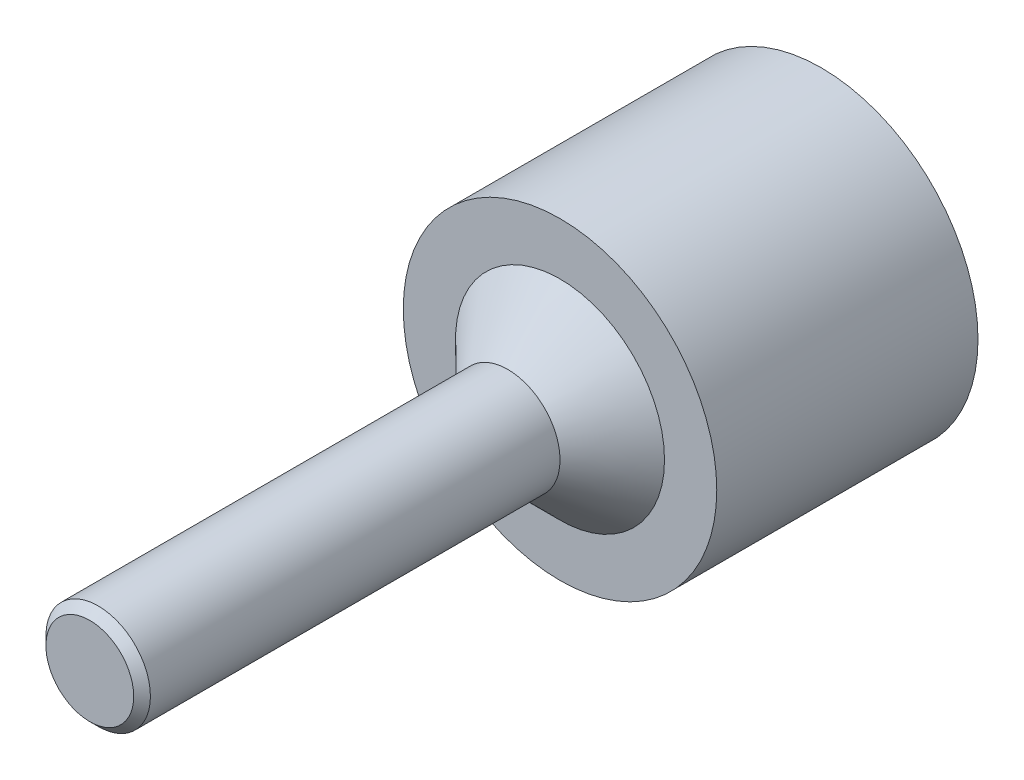
ISO-10303-21;
HEADER;
FILE_DESCRIPTION(('STEP AP214'),'2;1');
FILE_NAME('part.step','',(''),(''),'','','');
FILE_SCHEMA(('AUTOMOTIVE_DESIGN { 1 0 10303 214 1 1 1 1 }'));
ENDSEC;
DATA;
#1=APPLICATION_CONTEXT('core data for automotive mechanical design processes');
#2=APPLICATION_PROTOCOL_DEFINITION('international standard','automotive_design',2000,#1);
#3=PRODUCT_CONTEXT('',#1,'mechanical');
#4=PRODUCT('Part','Part','',(#3));
#5=PRODUCT_RELATED_PRODUCT_CATEGORY('part','',(#4));
#6=PRODUCT_DEFINITION_FORMATION('','',#4);
#7=PRODUCT_DEFINITION_CONTEXT('part definition',#1,'design');
#8=PRODUCT_DEFINITION('design','',#6,#7);
#9=PRODUCT_DEFINITION_SHAPE('','',#8);
#10=(LENGTH_UNIT() NAMED_UNIT(*) SI_UNIT(.MILLI.,.METRE.));
#11=(NAMED_UNIT(*) PLANE_ANGLE_UNIT() SI_UNIT($,.RADIAN.));
#12=(NAMED_UNIT(*) SI_UNIT($,.STERADIAN.) SOLID_ANGLE_UNIT());
#13=UNCERTAINTY_MEASURE_WITH_UNIT(LENGTH_MEASURE(1.E-05),#10,'distance_accuracy_value','');
#14=(GEOMETRIC_REPRESENTATION_CONTEXT(3) GLOBAL_UNCERTAINTY_ASSIGNED_CONTEXT((#13)) GLOBAL_UNIT_ASSIGNED_CONTEXT((#10,
#11,#12)) REPRESENTATION_CONTEXT('',''));
#15=CARTESIAN_POINT('',(0.,0.,0.));
#16=DIRECTION('',(0.,0.,1.));
#17=DIRECTION('',(1.,0.,0.));
#18=AXIS2_PLACEMENT_3D('',#15,#16,#17);
#19=CARTESIAN_POINT('',(0.,0.,0.));
#20=DIRECTION('',(0.,0.,1.));
#21=DIRECTION('',(1.,0.,0.));
#22=AXIS2_PLACEMENT_3D('',#19,#20,#21);
#23=PLANE('',#22);
#24=CARTESIAN_POINT('',(0.,0.,0.));
#25=DIRECTION('',(0.,0.,1.));
#26=DIRECTION('',(1.,0.,0.));
#27=AXIS2_PLACEMENT_3D('',#24,#25,#26);
#28=CIRCLE('',#27,2.66700000000002);
#29=CARTESIAN_POINT('',(2.66700000000002,0.,0.));
#30=VERTEX_POINT('',#29);
#31=EDGE_CURVE('E54',#30,#30,#28,.T.);
#32=ORIENTED_EDGE('',*,*,#31,.T.);
#33=EDGE_LOOP('',(#32));
#34=FACE_BOUND('',#33,.T.);
#35=ADVANCED_FACE('F34',(#34),#23,.T.);
#36=CARTESIAN_POINT('',(0.,0.,-44.45));
#37=DIRECTION('',(0.,0.,-1.));
#38=DIRECTION('',(-1.,0.,0.));
#39=AXIS2_PLACEMENT_3D('',#36,#37,#38);
#40=CYLINDRICAL_SURFACE('',#39,3.175);
#41=CARTESIAN_POINT('',(0.,0.,-25.4));
#42=DIRECTION('',(0.,0.,1.));
#43=DIRECTION('',(1.,0.,0.));
#44=AXIS2_PLACEMENT_3D('',#41,#42,#43);
#45=CIRCLE('',#44,3.175);
#46=CARTESIAN_POINT('',(3.175,0.,-25.4));
#47=VERTEX_POINT('',#46);
#48=EDGE_CURVE('E45',#47,#47,#45,.T.);
#49=ORIENTED_EDGE('',*,*,#48,.T.);
#50=EDGE_LOOP('',(#49));
#51=FACE_BOUND('',#50,.T.);
#52=CARTESIAN_POINT('',(0.,0.,-0.507999999999981));
#53=DIRECTION('',(0.,0.,1.));
#54=DIRECTION('',(1.,0.,0.));
#55=AXIS2_PLACEMENT_3D('',#52,#53,#54);
#56=CIRCLE('',#55,3.175);
#57=CARTESIAN_POINT('',(3.175,0.,-0.507999999999981));
#58=VERTEX_POINT('',#57);
#59=EDGE_CURVE('E57',#58,#58,#56,.F.);
#60=ORIENTED_EDGE('',*,*,#59,.T.);
#61=EDGE_LOOP('',(#60));
#62=FACE_BOUND('',#61,.T.);
#63=ADVANCED_FACE('F111',(#51,#62),#40,.T.);
#64=CARTESIAN_POINT('',(0.,3.175,-28.575));
#65=DIRECTION('',(0.,0.,1.));
#66=DIRECTION('',(1.,0.,0.));
#67=AXIS2_PLACEMENT_3D('',#64,#65,#66);
#68=PLANE('',#67);
#69=CARTESIAN_POINT('',(0.,0.,-28.575));
#70=DIRECTION('',(0.,0.,1.));
#71=DIRECTION('',(1.,0.,0.));
#72=AXIS2_PLACEMENT_3D('',#69,#70,#71);
#73=CIRCLE('',#72,6.35000000000003);
#74=CARTESIAN_POINT('',(6.35000000000003,0.,-28.575));
#75=VERTEX_POINT('',#74);
#76=EDGE_CURVE('E49',#75,#75,#73,.F.);
#77=ORIENTED_EDGE('',*,*,#76,.T.);
#78=EDGE_LOOP('',(#77));
#79=FACE_BOUND('',#78,.T.);
#80=CARTESIAN_POINT('',(0.,0.,-28.575));
#81=DIRECTION('',(0.,0.,-1.));
#82=DIRECTION('',(-1.,0.,0.));
#83=AXIS2_PLACEMENT_3D('',#80,#81,#82);
#84=CIRCLE('',#83,9.525);
#85=CARTESIAN_POINT('',(-9.525,0.,-28.575));
#86=VERTEX_POINT('',#85);
#87=EDGE_CURVE('E60',#86,#86,#84,.T.);
#88=ORIENTED_EDGE('',*,*,#87,.F.);
#89=EDGE_LOOP('',(#88));
#90=FACE_BOUND('',#89,.T.);
#91=ADVANCED_FACE('F107',(#79,#90),#68,.T.);
#92=CARTESIAN_POINT('',(0.,0.,-44.45));
#93=DIRECTION('',(0.,0.,-1.));
#94=DIRECTION('',(-1.,0.,0.));
#95=AXIS2_PLACEMENT_3D('',#92,#93,#94);
#96=CYLINDRICAL_SURFACE('',#95,9.525);
#97=CARTESIAN_POINT('',(0.,-9.525,-36.0553));
#98=CARTESIAN_POINT('',(0.0632509375219132,-9.52499915479188,-36.055297297543));
#99=CARTESIAN_POINT('',(0.126542029749758,-9.5243633064193,-36.0499728767562));
#100=CARTESIAN_POINT('',(0.251364820472078,-9.52188793721448,-36.0288157596332));
#101=CARTESIAN_POINT('',(0.312894581904218,-9.52004714057458,-36.0129719250133));
#102=CARTESIAN_POINT('',(0.432369436874991,-9.51536936505536,-35.9712478166958));
#103=CARTESIAN_POINT('',(0.490316847005159,-9.51253303804938,-35.9453741094042));
#104=CARTESIAN_POINT('',(0.601035404846345,-9.506180121912,-35.8843386531454));
#105=CARTESIAN_POINT('',(0.653807476710619,-9.5026636545669,-35.849178566591));
#106=CARTESIAN_POINT('',(0.75295182295395,-9.49532382723017,-35.7703809010455));
#107=CARTESIAN_POINT('',(0.799294604149035,-9.49149917244225,-35.7267063302383));
#108=CARTESIAN_POINT('',(0.884010990406445,-9.48398454417843,-35.6321987812117));
#109=CARTESIAN_POINT('',(0.9223842000221,-9.48029457739317,-35.5813654479875));
#110=CARTESIAN_POINT('',(0.990180703567409,-9.47345427413314,-35.4737934148364));
#111=CARTESIAN_POINT('',(1.01957659957805,-9.47030560217059,-35.4170373326192));
#112=CARTESIAN_POINT('',(1.06840907808638,-9.46492124661159,-35.299350669313));
#113=CARTESIAN_POINT('',(1.08784600183097,-9.46268553173296,-35.2384202313406));
#114=CARTESIAN_POINT('',(1.11611970355341,-9.45939245018979,-35.1144193257095));
#115=CARTESIAN_POINT('',(1.12500607633105,-9.45832957207026,-35.0513603151556));
#116=CARTESIAN_POINT('',(1.13207984575786,-9.45748558744171,-34.9246377020031));
#117=CARTESIAN_POINT('',(1.13026763163491,-9.45770443430195,-34.8609741214835));
#118=CARTESIAN_POINT('',(1.11603642445577,-9.45939413033264,-34.7351941413619));
#119=CARTESIAN_POINT('',(1.10367192939602,-9.4608585465419,-34.673071476993));
#120=CARTESIAN_POINT('',(1.06877210956582,-9.46486434331535,-34.5517891324808));
#121=CARTESIAN_POINT('',(1.04623659739191,-9.4674057437232,-34.4926295069546));
#122=CARTESIAN_POINT('',(0.991575435750871,-9.47328648500057,-34.3787824780618));
#123=CARTESIAN_POINT('',(0.959425968133552,-9.47662780348318,-34.3241066167749));
#124=CARTESIAN_POINT('',(0.886466559501058,-9.48373033604865,-34.2209055915384));
#125=CARTESIAN_POINT('',(0.845656261347887,-9.48749156744401,-34.1723806813613));
#126=CARTESIAN_POINT('',(0.756230970668205,-9.49503875161689,-34.0825425781642));
#127=CARTESIAN_POINT('',(0.707568978368591,-9.49882471254411,-34.041276155214));
#128=CARTESIAN_POINT('',(0.603983835638155,-9.5059728190733,-33.9674901344518));
#129=CARTESIAN_POINT('',(0.54906067309011,-9.50933496385503,-33.934970553568));
#130=CARTESIAN_POINT('',(0.434477192227891,-9.51525841591306,-33.8796018187119));
#131=CARTESIAN_POINT('',(0.374815519825478,-9.51781949323438,-33.8567554408717));
#132=CARTESIAN_POINT('',(0.252465658532564,-9.52185010274536,-33.8214179814958));
#133=CARTESIAN_POINT('',(0.189777597381649,-9.52331968096283,-33.8089264632998));
#134=CARTESIAN_POINT('',(0.0635590107666494,-9.52499574893122,-33.7947135769098));
#135=CARTESIAN_POINT('',(3.58400083115345E-05,-9.52520979797053,-33.7929277504638));
#136=CARTESIAN_POINT('',(-0.126404631849715,-9.5243710616825,-33.8000070558713));
#137=CARTESIAN_POINT('',(-0.189321944527946,-9.52331830061377,-33.8088719837697));
#138=CARTESIAN_POINT('',(-0.31257565042343,-9.52006897220776,-33.8369476249329));
#139=CARTESIAN_POINT('',(-0.372919106821374,-9.51787578670261,-33.8561277550712));
#140=CARTESIAN_POINT('',(-0.489532754276605,-9.51259128030109,-33.9042576519216));
#141=CARTESIAN_POINT('',(-0.545802819522162,-9.50949993167863,-33.9332077202341));
#142=CARTESIAN_POINT('',(-0.652961239170925,-9.50274519697551,-34.0002127279642));
#143=CARTESIAN_POINT('',(-0.703823242482479,-9.49907920769755,-34.0383095427701));
#144=CARTESIAN_POINT('',(-0.798454027403535,-9.49159384532421,-34.1224671551165));
#145=CARTESIAN_POINT('',(-0.84222255607325,-9.48777446676533,-34.1685282365267));
#146=CARTESIAN_POINT('',(-0.921651327981496,-9.48038962493188,-34.2675900911426));
#147=CARTESIAN_POINT('',(-0.957268957312505,-9.47682556018667,-34.3206251519108));
#148=CARTESIAN_POINT('',(-1.01909088187736,-9.47037744686408,-34.4319623704647));
#149=CARTESIAN_POINT('',(-1.04529534989561,-9.46749338580514,-34.4902644315466));
#150=CARTESIAN_POINT('',(-1.08747746493127,-9.46274116392142,-34.6103408097394));
#151=CARTESIAN_POINT('',(-1.10347950086257,-9.46087058199655,-34.6721064592944));
#152=CARTESIAN_POINT('',(-1.12488122562179,-9.45835002776142,-34.7974716266512));
#153=CARTESIAN_POINT('',(-1.13028135522926,-9.45770000470587,-34.8610710681007));
#154=CARTESIAN_POINT('',(-1.1303184331302,-9.45769553968786,-34.9878746425039));
#155=CARTESIAN_POINT('',(-1.12502232452988,-9.45833303967828,-35.0510787661036));
#156=CARTESIAN_POINT('',(-1.10395863981905,-9.46081450631757,-35.1756920137754));
#157=CARTESIAN_POINT('',(-1.08819105929352,-9.46265847347512,-35.2371011370908));
#158=CARTESIAN_POINT('',(-1.04665229311139,-9.4673426850713,-35.3563746331136));
#159=CARTESIAN_POINT('',(-1.02088399489125,-9.47018264192209,-35.4142400233998));
#160=CARTESIAN_POINT('',(-0.960081888687954,-9.47653934827966,-35.5248359739942));
#161=CARTESIAN_POINT('',(-0.925048010140118,-9.48005610294073,-35.5775664951921));
#162=CARTESIAN_POINT('',(-0.846459876445609,-9.4873965412942,-35.6767384262747));
#163=CARTESIAN_POINT('',(-0.802855698093828,-9.4912219419892,-35.7231401500643));
#164=CARTESIAN_POINT('',(-0.708467950989531,-9.49873331929353,-35.8079943441698));
#165=CARTESIAN_POINT('',(-0.657682685184871,-9.50241926268421,-35.8464449301491));
#166=CARTESIAN_POINT('',(-0.55017587524167,-9.50925025151029,-35.9144161624646));
#167=CARTESIAN_POINT('',(-0.493434507280825,-9.51239339223359,-35.9439056282208));
#168=CARTESIAN_POINT('',(-0.375800731512537,-9.51776504462355,-35.9928963446553));
#169=CARTESIAN_POINT('',(-0.314912964671017,-9.51999455988771,-36.0124085609953));
#170=CARTESIAN_POINT('',(-0.211418114793812,-9.5227440281588,-36.0361665421134));
#171=CARTESIAN_POINT('',(-0.169466299617016,-9.52358594491639,-36.0433314180665));
#172=CARTESIAN_POINT('',(-0.0850157018599239,-9.52471421312899,-36.0528990400399));
#173=CARTESIAN_POINT('',(-0.0425169227863945,-9.52500056814412,-36.0553018165763));
#174=CARTESIAN_POINT('',(0.,-9.525,-36.0553));
#175=B_SPLINE_CURVE_WITH_KNOTS('',3,(#97,#98,#99,#100,#101,#102,#103,#104,#105,#106,#107,#108,
#109,#110,#111,#112,#113,#114,#115,#116,#117,#118,#119,#120,#121,#122,#123,#124,#125,#126,#127,
#128,#129,#130,#131,#132,#133,#134,#135,#136,#137,#138,#139,#140,#141,#142,#143,#144,#145,#146,
#147,#148,#149,#150,#151,#152,#153,#154,#155,#156,#157,#158,#159,#160,#161,#162,#163,#164,#165,
#166,#167,#168,#169,#170,#171,#172,#173,#174),.UNSPECIFIED.,.T.,.F.,(4,2,2,2,2,2,2,2,2,2,2,2,2,
2,2,2,2,2,2,2,2,2,2,2,2,2,2,2,2,2,2,2,2,2,2,2,2,2,4),(0.,0.189597524312163,0.379396121234884,
0.569070669169936,0.758711285265451,0.949194948105546,1.13968806040505,1.33075686013229,
1.52181911239724,1.71197964005891,1.90213324948718,2.09131069927981,2.28049163485502,
2.47014519648381,2.65980658018673,2.8506485273792,3.04149084391374,3.232387893604,
3.4232768928326,3.61301539850876,3.80275027087081,3.99192568241037,4.18110693437604,
4.37117138460746,4.56124261068453,4.75228593782412,4.94332575806604,5.13390716820241,
5.32448065465381,5.51386512071869,5.70324966663246,5.89257957351562,6.08191092233626,
6.27237971236643,6.46289358990969,6.65406297150348,6.8450217911509,6.97246899232318,
7.09991537679581),.UNSPECIFIED.);
#176=CARTESIAN_POINT('',(0.,-9.525,-36.0553));
#177=VERTEX_POINT('',#176);
#178=EDGE_CURVE('E220',#177,#177,#175,.T.);
#179=ORIENTED_EDGE('',*,*,#178,.F.);
#180=EDGE_LOOP('',(#179));
#181=FACE_BOUND('',#180,.T.);
#182=CARTESIAN_POINT('',(0.,-9.525,-42.4053));
#183=CARTESIAN_POINT('',(0.0632509375219132,-9.52499915479188,-42.405297297543));
#184=CARTESIAN_POINT('',(0.126542029749758,-9.5243633064193,-42.3999728767562));
#185=CARTESIAN_POINT('',(0.251364820472078,-9.52188793721448,-42.3788157596331));
#186=CARTESIAN_POINT('',(0.312894581904218,-9.52004714057458,-42.3629719250133));
#187=CARTESIAN_POINT('',(0.432369436874991,-9.51536936505536,-42.3212478166958));
#188=CARTESIAN_POINT('',(0.490316847005159,-9.51253303804938,-42.2953741094042));
#189=CARTESIAN_POINT('',(0.601035404846345,-9.506180121912,-42.2343386531454));
#190=CARTESIAN_POINT('',(0.65380747671062,-9.5026636545669,-42.199178566591));
#191=CARTESIAN_POINT('',(0.752951822953947,-9.49532382723017,-42.1203809010455));
#192=CARTESIAN_POINT('',(0.79929460414903,-9.49149917244225,-42.0767063302383));
#193=CARTESIAN_POINT('',(0.884010990406441,-9.48398454417843,-41.9821987812117));
#194=CARTESIAN_POINT('',(0.922384200022098,-9.48029457739317,-41.9313654479875));
#195=CARTESIAN_POINT('',(0.990180703567409,-9.47345427413314,-41.8237934148364));
#196=CARTESIAN_POINT('',(1.01957659957805,-9.47030560217059,-41.7670373326192));
#197=CARTESIAN_POINT('',(1.06840907808638,-9.46492124661159,-41.649350669313));
#198=CARTESIAN_POINT('',(1.08784600183097,-9.46268553173296,-41.5884202313406));
#199=CARTESIAN_POINT('',(1.11611970355341,-9.45939245018979,-41.4644193257095));
#200=CARTESIAN_POINT('',(1.12500607633105,-9.45832957207026,-41.4013603151556));
#201=CARTESIAN_POINT('',(1.13207984575786,-9.45748558744171,-41.2746377020031));
#202=CARTESIAN_POINT('',(1.13026763163491,-9.45770443430195,-41.2109741214835));
#203=CARTESIAN_POINT('',(1.11603642445577,-9.45939413033264,-41.0851941413619));
#204=CARTESIAN_POINT('',(1.10367192939602,-9.4608585465419,-41.023071476993));
#205=CARTESIAN_POINT('',(1.06877210956582,-9.46486434331535,-40.9017891324808));
#206=CARTESIAN_POINT('',(1.04623659739191,-9.4674057437232,-40.8426295069546));
#207=CARTESIAN_POINT('',(0.99157543575087,-9.47328648500057,-40.7287824780617));
#208=CARTESIAN_POINT('',(0.95942596813355,-9.47662780348318,-40.6741066167748));
#209=CARTESIAN_POINT('',(0.886466559501056,-9.48373033604865,-40.5709055915384));
#210=CARTESIAN_POINT('',(0.845656261347885,-9.48749156744401,-40.5223806813613));
#211=CARTESIAN_POINT('',(0.756230970668205,-9.49503875161689,-40.4325425781642));
#212=CARTESIAN_POINT('',(0.707568978368591,-9.49882471254411,-40.391276155214));
#213=CARTESIAN_POINT('',(0.603983835638155,-9.5059728190733,-40.3174901344518));
#214=CARTESIAN_POINT('',(0.54906067309011,-9.50933496385503,-40.284970553568));
#215=CARTESIAN_POINT('',(0.434477192227891,-9.51525841591306,-40.2296018187119));
#216=CARTESIAN_POINT('',(0.374815519825478,-9.51781949323438,-40.2067554408717));
#217=CARTESIAN_POINT('',(0.252465658532564,-9.52185010274536,-40.1714179814958));
#218=CARTESIAN_POINT('',(0.189777597381649,-9.52331968096283,-40.1589264632998));
#219=CARTESIAN_POINT('',(0.0635590107666494,-9.52499574893122,-40.1447135769098));
#220=CARTESIAN_POINT('',(3.58400083115345E-05,-9.52520979797053,-40.1429277504638));
#221=CARTESIAN_POINT('',(-0.126404631849715,-9.5243710616825,-40.1500070558713));
#222=CARTESIAN_POINT('',(-0.189321944527946,-9.52331830061377,-40.1588719837697));
#223=CARTESIAN_POINT('',(-0.31257565042343,-9.52006897220776,-40.1869476249329));
#224=CARTESIAN_POINT('',(-0.372919106821374,-9.51787578670261,-40.2061277550712));
#225=CARTESIAN_POINT('',(-0.489532754276605,-9.51259128030109,-40.2542576519216));
#226=CARTESIAN_POINT('',(-0.545802819522162,-9.50949993167863,-40.2832077202341));
#227=CARTESIAN_POINT('',(-0.652961239170925,-9.50274519697551,-40.3502127279642));
#228=CARTESIAN_POINT('',(-0.703823242482479,-9.49907920769755,-40.3883095427701));
#229=CARTESIAN_POINT('',(-0.798454027403535,-9.49159384532421,-40.4724671551165));
#230=CARTESIAN_POINT('',(-0.84222255607325,-9.48777446676533,-40.5185282365267));
#231=CARTESIAN_POINT('',(-0.921651327981496,-9.48038962493188,-40.6175900911426));
#232=CARTESIAN_POINT('',(-0.957268957312505,-9.47682556018667,-40.6706251519108));
#233=CARTESIAN_POINT('',(-1.01909088187736,-9.47037744686408,-40.7819623704647));
#234=CARTESIAN_POINT('',(-1.04529534989561,-9.46749338580514,-40.8402644315466));
#235=CARTESIAN_POINT('',(-1.08747746493127,-9.46274116392142,-40.9603408097394));
#236=CARTESIAN_POINT('',(-1.10347950086257,-9.46087058199655,-41.0221064592943));
#237=CARTESIAN_POINT('',(-1.12488122562179,-9.45835002776142,-41.1474716266512));
#238=CARTESIAN_POINT('',(-1.13028135522926,-9.45770000470587,-41.2110710681007));
#239=CARTESIAN_POINT('',(-1.1303184331302,-9.45769553968786,-41.3378746425039));
#240=CARTESIAN_POINT('',(-1.12502232452988,-9.45833303967828,-41.4010787661036));
#241=CARTESIAN_POINT('',(-1.10395863981905,-9.46081450631757,-41.5256920137754));
#242=CARTESIAN_POINT('',(-1.08819105929352,-9.46265847347512,-41.5871011370908));
#243=CARTESIAN_POINT('',(-1.04665229311139,-9.4673426850713,-41.7063746331136));
#244=CARTESIAN_POINT('',(-1.02088399489125,-9.47018264192209,-41.7642400233998));
#245=CARTESIAN_POINT('',(-0.960081888687954,-9.47653934827966,-41.8748359739941));
#246=CARTESIAN_POINT('',(-0.925048010140118,-9.48005610294073,-41.9275664951921));
#247=CARTESIAN_POINT('',(-0.846459876445609,-9.4873965412942,-42.0267384262747));
#248=CARTESIAN_POINT('',(-0.802855698093828,-9.4912219419892,-42.0731401500643));
#249=CARTESIAN_POINT('',(-0.708467950989531,-9.49873331929353,-42.1579943441698));
#250=CARTESIAN_POINT('',(-0.657682685184871,-9.50241926268421,-42.1964449301491));
#251=CARTESIAN_POINT('',(-0.55017587524167,-9.50925025151029,-42.2644161624645));
#252=CARTESIAN_POINT('',(-0.493434507280825,-9.51239339223359,-42.2939056282208));
#253=CARTESIAN_POINT('',(-0.375800731512537,-9.51776504462355,-42.3428963446553));
#254=CARTESIAN_POINT('',(-0.314912964671017,-9.51999455988771,-42.3624085609953));
#255=CARTESIAN_POINT('',(-0.211418114793812,-9.5227440281588,-42.3861665421134));
#256=CARTESIAN_POINT('',(-0.169466299617016,-9.52358594491639,-42.3933314180665));
#257=CARTESIAN_POINT('',(-0.0850157018599239,-9.52471421312899,-42.4028990400399));
#258=CARTESIAN_POINT('',(-0.0425169227863945,-9.52500056814412,-42.4053018165763));
#259=CARTESIAN_POINT('',(0.,-9.525,-42.4053));
#260=B_SPLINE_CURVE_WITH_KNOTS('',3,(#182,#183,#184,#185,#186,#187,#188,#189,#190,#191,#192,
#193,#194,#195,#196,#197,#198,#199,#200,#201,#202,#203,#204,#205,#206,#207,#208,#209,#210,#211,
#212,#213,#214,#215,#216,#217,#218,#219,#220,#221,#222,#223,#224,#225,#226,#227,#228,#229,#230,
#231,#232,#233,#234,#235,#236,#237,#238,#239,#240,#241,#242,#243,#244,#245,#246,#247,#248,#249,
#250,#251,#252,#253,#254,#255,#256,#257,#258,#259),.UNSPECIFIED.,.T.,.F.,(4,2,2,2,2,2,2,2,2,2,2,
2,2,2,2,2,2,2,2,2,2,2,2,2,2,2,2,2,2,2,2,2,2,2,2,2,2,2,4),(0.,0.189597524312163,
0.379396121234884,0.569070669169936,0.758711285265451,0.949194948105536,1.13968806040505,
1.33075686013229,1.52181911239724,1.71197964005891,1.90213324948718,2.09131069927981,
2.28049163485502,2.47014519648381,2.65980658018673,2.8506485273792,3.04149084391374,
3.232387893604,3.4232768928326,3.61301539850876,3.80275027087081,3.99192568241037,
4.18110693437604,4.37117138460746,4.56124261068453,4.75228593782412,4.94332575806604,
5.13390716820241,5.32448065465381,5.51386512071869,5.70324966663246,5.89257957351562,
6.08191092233626,6.27237971236643,6.46289358990969,6.65406297150348,6.8450217911509,
6.97246899232318,7.09991537679581),.UNSPECIFIED.);
#261=CARTESIAN_POINT('',(0.,-9.525,-42.4053));
#262=VERTEX_POINT('',#261);
#263=EDGE_CURVE('E69',#262,#262,#260,.T.);
#264=ORIENTED_EDGE('',*,*,#263,.F.);
#265=EDGE_LOOP('',(#264));
#266=FACE_BOUND('',#265,.T.);
#267=ORIENTED_EDGE('',*,*,#87,.T.);
#268=EDGE_LOOP('',(#267));
#269=FACE_BOUND('',#268,.T.);
#270=CARTESIAN_POINT('',(0.,0.,-44.45));
#271=DIRECTION('',(0.,0.,-1.));
#272=DIRECTION('',(-1.,0.,0.));
#273=AXIS2_PLACEMENT_3D('',#270,#271,#272);
#274=CIRCLE('',#273,9.525);
#275=CARTESIAN_POINT('',(-9.525,0.,-44.45));
#276=VERTEX_POINT('',#275);
#277=EDGE_CURVE('E63',#276,#276,#274,.T.);
#278=ORIENTED_EDGE('',*,*,#277,.F.);
#279=EDGE_LOOP('',(#278));
#280=FACE_BOUND('',#279,.T.);
#281=ADVANCED_FACE('F81',(#181,#266,#269,#280),#96,.T.);
#282=CARTESIAN_POINT('',(0.,9.525,-44.45));
#283=DIRECTION('',(0.,0.,-1.));
#284=DIRECTION('',(-1.,0.,0.));
#285=AXIS2_PLACEMENT_3D('',#282,#283,#284);
#286=PLANE('',#285);
#287=CARTESIAN_POINT('',(0.,0.,-44.45));
#288=DIRECTION('',(0.,0.,-1.));
#289=DIRECTION('',(-1.,0.,0.));
#290=AXIS2_PLACEMENT_3D('',#287,#288,#289);
#291=CIRCLE('',#290,6.85800000000001);
#292=CARTESIAN_POINT('',(-6.85800000000001,0.,-44.45));
#293=VERTEX_POINT('',#292);
#294=EDGE_CURVE('E10',#293,#293,#291,.F.);
#295=ORIENTED_EDGE('',*,*,#294,.T.);
#296=EDGE_LOOP('',(#295));
#297=FACE_BOUND('',#296,.T.);
#298=ORIENTED_EDGE('',*,*,#277,.T.);
#299=EDGE_LOOP('',(#298));
#300=FACE_BOUND('',#299,.T.);
#301=ADVANCED_FACE('F102',(#297,#300),#286,.T.);
#302=CARTESIAN_POINT('',(0.,0.,-31.75));
#303=DIRECTION('',(0.,0.,-1.));
#304=DIRECTION('',(-1.,0.,0.));
#305=AXIS2_PLACEMENT_3D('',#302,#303,#304);
#306=CYLINDRICAL_SURFACE('',#305,6.35);
#307=CARTESIAN_POINT('',(0.,0.,-43.942));
#308=DIRECTION('',(0.,0.,-1.));
#309=DIRECTION('',(-1.,0.,0.));
#310=AXIS2_PLACEMENT_3D('',#307,#308,#309);
#311=CIRCLE('',#310,6.35);
#312=CARTESIAN_POINT('',(-6.35,0.,-43.942));
#313=VERTEX_POINT('',#312);
#314=EDGE_CURVE('E41',#313,#313,#311,.T.);
#315=ORIENTED_EDGE('',*,*,#314,.T.);
#316=EDGE_LOOP('',(#315));
#317=FACE_BOUND('',#316,.T.);
#318=CARTESIAN_POINT('',(0.,-6.35,-36.0553));
#319=CARTESIAN_POINT('',(0.0629563878791093,-6.3499988839214,-36.0552975358588));
#320=CARTESIAN_POINT('',(0.125945518180088,-6.34905403128448,-36.0500223318021));
#321=CARTESIAN_POINT('',(0.250152702081869,-6.3453758553173,-36.029072214923));
#322=CARTESIAN_POINT('',(0.31136914852081,-6.34264095902063,-36.0133881553497));
#323=CARTESIAN_POINT('',(0.430216353374726,-6.33568901554255,-35.972112560627));
#324=CARTESIAN_POINT('',(0.487850157656381,-6.33147324821675,-35.9465295787746));
#325=CARTESIAN_POINT('',(0.598001091171563,-6.32202140996736,-35.8862057604103));
#326=CARTESIAN_POINT('',(0.650518713767407,-6.31678543757031,-35.8514658081206));
#327=CARTESIAN_POINT('',(0.74952221648712,-6.3058088163252,-35.77341393982));
#328=CARTESIAN_POINT('',(0.795944583557263,-6.30006376112309,-35.7300220730176));
#329=CARTESIAN_POINT('',(0.880890742796278,-6.28874965760556,-35.6360701564786));
#330=CARTESIAN_POINT('',(0.919414000884791,-6.28318062121278,-35.5855096224394));
#331=CARTESIAN_POINT('',(0.987728082473346,-6.27280636489557,-35.4782125973316));
#332=CARTESIAN_POINT('',(1.01745513923004,-6.26800683286247,-35.4214349089762));
#333=CARTESIAN_POINT('',(1.0669249737415,-6.25977667220809,-35.3035918933421));
#334=CARTESIAN_POINT('',(1.08666852406105,-6.25634593766797,-35.2425268982494));
#335=CARTESIAN_POINT('',(1.11540879351234,-6.2512859511231,-35.1185193778503));
#336=CARTESIAN_POINT('',(1.12451576700911,-6.24963823052388,-35.0556031735483));
#337=CARTESIAN_POINT('',(1.1320664164924,-6.24827506974414,-34.9291158273611));
#338=CARTESIAN_POINT('',(1.13051095346756,-6.24855947354512,-34.8655447387717));
#339=CARTESIAN_POINT('',(1.11687047479473,-6.25101158981713,-34.7403454074331));
#340=CARTESIAN_POINT('',(1.10491011333064,-6.25315700585985,-34.6787030828505));
#341=CARTESIAN_POINT('',(1.07099533738571,-6.25905444840308,-34.5583141852722));
#342=CARTESIAN_POINT('',(1.049040536489,-6.26280653702218,-34.4995677243369));
#343=CARTESIAN_POINT('',(0.995636097085759,-6.2715182331776,-34.3862694559734));
#344=CARTESIAN_POINT('',(0.964135455052854,-6.27648429874685,-34.3317422066748));
#345=CARTESIAN_POINT('',(0.892569656940643,-6.28706003112924,-34.2287003160346));
#346=CARTESIAN_POINT('',(0.852503715015034,-6.29266975697482,-34.1801862270321));
#347=CARTESIAN_POINT('',(0.764269222158467,-6.30399827594321,-34.0898269353825));
#348=CARTESIAN_POINT('',(0.715993892439709,-6.30971748810976,-34.0480859830462));
#349=CARTESIAN_POINT('',(0.613070078093332,-6.32054731368641,-33.9732802859317));
#350=CARTESIAN_POINT('',(0.558421540967499,-6.32565792208254,-33.9402156126301));
#351=CARTESIAN_POINT('',(0.444198884642503,-6.33470353710574,-33.8836884751575));
#352=CARTESIAN_POINT('',(0.384619676136642,-6.33863730921633,-33.8602360849223));
#353=CARTESIAN_POINT('',(0.262282092255562,-6.34487632476616,-33.8237005590735));
#354=CARTESIAN_POINT('',(0.199524021375925,-6.34718172386837,-33.8106164322997));
#355=CARTESIAN_POINT('',(0.0735078508517702,-6.34988306770141,-33.7953321695874));
#356=CARTESIAN_POINT('',(0.0102676109126001,-6.35030409228237,-33.7929890670603));
#357=CARTESIAN_POINT('',(-0.115701348621398,-6.34925825163245,-33.7988709711615));
#358=CARTESIAN_POINT('',(-0.178430090650149,-6.34779146965248,-33.8070955117643));
#359=CARTESIAN_POINT('',(-0.301147522772468,-6.34315039678748,-33.8337603424249));
#360=CARTESIAN_POINT('',(-0.36115226452032,-6.33998807934095,-33.8521290241086));
#361=CARTESIAN_POINT('',(-0.477230535073565,-6.33230904006331,-33.8984837697222));
#362=CARTESIAN_POINT('',(-0.533303817796235,-6.32779223354356,-33.926470435027));
#363=CARTESIAN_POINT('',(-0.640542721018921,-6.31784277068134,-33.9915883000618));
#364=CARTESIAN_POINT('',(-0.69165391851603,-6.31240144327334,-34.0288077747074));
#365=CARTESIAN_POINT('',(-0.786956260083879,-6.30123054524762,-34.111214359984));
#366=CARTESIAN_POINT('',(-0.831146825340833,-6.29550095057328,-34.1564021363805));
#367=CARTESIAN_POINT('',(-0.911890524213836,-6.28431705815892,-34.2541070831868));
#368=CARTESIAN_POINT('',(-0.948346537135835,-6.27886684675114,-34.3067050581005));
#369=CARTESIAN_POINT('',(-1.01190558831821,-6.26893820466268,-34.4173624551639));
#370=CARTESIAN_POINT('',(-1.03900895164483,-6.2644597402094,-34.4754216874095));
#371=CARTESIAN_POINT('',(-1.08295206493416,-6.25701307344201,-34.5950952194019));
#372=CARTESIAN_POINT('',(-1.09983812432204,-6.25403806705127,-34.6566920718548));
#373=CARTESIAN_POINT('',(-1.12301156564012,-6.24991887731239,-34.7819059154928));
#374=CARTESIAN_POINT('',(-1.12930001283747,-6.24877450994984,-34.8455227029798));
#375=CARTESIAN_POINT('',(-1.13106684825176,-6.24845484979012,-34.9719992157033));
#376=CARTESIAN_POINT('',(-1.12669827021579,-6.24925168135855,-35.0348567842946));
#377=CARTESIAN_POINT('',(-1.10760816297116,-6.25266316282823,-35.1589267560641));
#378=CARTESIAN_POINT('',(-1.09288668165289,-6.25527780432068,-35.220139166851));
#379=CARTESIAN_POINT('',(-1.05357047523371,-6.26201909575184,-35.3391097605245));
#380=CARTESIAN_POINT('',(-1.02899073220675,-6.26614345047997,-35.3968730328797));
#381=CARTESIAN_POINT('',(-0.9706719556696,-6.27544134328702,-35.5074805580941));
#382=CARTESIAN_POINT('',(-0.936932364525781,-6.28061494523719,-35.5603245112116));
#383=CARTESIAN_POINT('',(-0.860712930365979,-6.29151580295166,-35.660363077428));
#384=CARTESIAN_POINT('',(-0.818121129276669,-6.29724959616527,-35.707471690834));
#385=CARTESIAN_POINT('',(-0.725641135508032,-6.30857437800572,-35.7939248181567));
#386=CARTESIAN_POINT('',(-0.675751266606114,-6.31416533347806,-35.8332675435114));
#387=CARTESIAN_POINT('',(-0.569614887399338,-6.32462666894718,-35.9033632555986));
#388=CARTESIAN_POINT('',(-0.513320736215192,-6.32949092933149,-35.9340450384979));
#389=CARTESIAN_POINT('',(-0.39631076881733,-6.33789122140251,-35.985467681174));
#390=CARTESIAN_POINT('',(-0.335599289969208,-6.34142853555049,-36.0062181447091));
#391=CARTESIAN_POINT('',(-0.228901192837829,-6.34603119498659,-36.0328383967695));
#392=CARTESIAN_POINT('',(-0.183549007984971,-6.34751130526661,-36.0412475339284));
#393=CARTESIAN_POINT('',(-0.0921370516835585,-6.34949610579554,-36.0524791777076));
#394=CARTESIAN_POINT('',(-0.0460772953483353,-6.35000081684933,-36.055301803486));
#395=CARTESIAN_POINT('',(0.,-6.35,-36.0553));
#396=B_SPLINE_CURVE_WITH_KNOTS('',3,(#318,#319,#320,#321,#322,#323,#324,#325,#326,#327,#328,
#329,#330,#331,#332,#333,#334,#335,#336,#337,#338,#339,#340,#341,#342,#343,#344,#345,#346,#347,
#348,#349,#350,#351,#352,#353,#354,#355,#356,#357,#358,#359,#360,#361,#362,#363,#364,#365,#366,
#367,#368,#369,#370,#371,#372,#373,#374,#375,#376,#377,#378,#379,#380,#381,#382,#383,#384,#385,
#386,#387,#388,#389,#390,#391,#392,#393,#394,#395),.UNSPECIFIED.,.T.,.F.,(4,2,2,2,2,2,2,2,2,2,2,
2,2,2,2,2,2,2,2,2,2,2,2,2,2,2,2,2,2,2,2,2,2,2,2,2,2,2,4),(0.,0.188700695089458,
0.377567430304385,0.566271335794908,0.754957026188631,0.945474674221972,1.13600519943005,
1.32788488763882,1.51974972513487,1.70960760659306,1.89945015726347,2.08704917225957,
2.27465544102885,2.46328231488539,2.65192650225096,2.84324403808115,3.03456314996839,
3.22608225995457,3.41758305935036,3.6065273740334,3.79546335669533,3.98308236329304,
4.17071310310581,4.36021202617093,4.54972678970789,4.74149628669667,4.93325911775941,
5.12414615244469,5.31501399810742,5.50315717677203,5.69129948513105,5.87915694151399,
6.06702583685677,6.25743369109013,6.44788534712722,6.63985995513198,6.83164854337839,
6.96976007448539,7.10786865969789),.UNSPECIFIED.);
#397=CARTESIAN_POINT('',(0.,-6.35,-36.0553));
#398=VERTEX_POINT('',#397);
#399=EDGE_CURVE('E217',#398,#398,#396,.T.);
#400=ORIENTED_EDGE('',*,*,#399,.T.);
#401=EDGE_LOOP('',(#400));
#402=FACE_BOUND('',#401,.T.);
#403=CARTESIAN_POINT('',(0.,-6.35,-42.4053));
#404=CARTESIAN_POINT('',(0.0629563878791093,-6.3499988839214,-42.4052975358588));
#405=CARTESIAN_POINT('',(0.125945518180088,-6.34905403128448,-42.4000223318021));
#406=CARTESIAN_POINT('',(0.250152702081869,-6.3453758553173,-42.3790722149229));
#407=CARTESIAN_POINT('',(0.31136914852081,-6.34264095902063,-42.3633881553496));
#408=CARTESIAN_POINT('',(0.430216353374726,-6.33568901554255,-42.322112560627));
#409=CARTESIAN_POINT('',(0.487850157656382,-6.33147324821675,-42.2965295787746));
#410=CARTESIAN_POINT('',(0.598001091171563,-6.32202140996736,-42.2362057604103));
#411=CARTESIAN_POINT('',(0.650518713767407,-6.31678543757031,-42.2014658081206));
#412=CARTESIAN_POINT('',(0.749522216487118,-6.3058088163252,-42.12341393982));
#413=CARTESIAN_POINT('',(0.795944583557261,-6.30006376112309,-42.0800220730176));
#414=CARTESIAN_POINT('',(0.880890742796277,-6.28874965760557,-41.9860701564785));
#415=CARTESIAN_POINT('',(0.91941400088479,-6.28318062121278,-41.9355096224394));
#416=CARTESIAN_POINT('',(0.987728082473344,-6.27280636489557,-41.8282125973316));
#417=CARTESIAN_POINT('',(1.01745513923004,-6.26800683286247,-41.7714349089762));
#418=CARTESIAN_POINT('',(1.0669249737415,-6.2597766722081,-41.6535918933421));
#419=CARTESIAN_POINT('',(1.08666852406105,-6.25634593766797,-41.5925268982494));
#420=CARTESIAN_POINT('',(1.11540879351234,-6.2512859511231,-41.4685193778503));
#421=CARTESIAN_POINT('',(1.12451576700911,-6.24963823052388,-41.4056031735483));
#422=CARTESIAN_POINT('',(1.1320664164924,-6.24827506974414,-41.2791158273611));
#423=CARTESIAN_POINT('',(1.13051095346756,-6.24855947354512,-41.2155447387717));
#424=CARTESIAN_POINT('',(1.11687047479473,-6.25101158981713,-41.0903454074331));
#425=CARTESIAN_POINT('',(1.10491011333064,-6.25315700585985,-41.0287030828505));
#426=CARTESIAN_POINT('',(1.07099533738571,-6.25905444840308,-40.9083141852722));
#427=CARTESIAN_POINT('',(1.049040536489,-6.26280653702218,-40.8495677243369));
#428=CARTESIAN_POINT('',(0.995636097085759,-6.2715182331776,-40.7362694559734));
#429=CARTESIAN_POINT('',(0.964135455052854,-6.27648429874685,-40.6817422066748));
#430=CARTESIAN_POINT('',(0.892569656940643,-6.28706003112924,-40.5787003160346));
#431=CARTESIAN_POINT('',(0.852503715015034,-6.29266975697482,-40.5301862270321));
#432=CARTESIAN_POINT('',(0.764269222158467,-6.30399827594321,-40.4398269353825));
#433=CARTESIAN_POINT('',(0.715993892439709,-6.30971748810976,-40.3980859830462));
#434=CARTESIAN_POINT('',(0.613070078093332,-6.32054731368641,-40.3232802859317));
#435=CARTESIAN_POINT('',(0.558421540967499,-6.32565792208254,-40.29021561263));
#436=CARTESIAN_POINT('',(0.444198884642503,-6.33470353710574,-40.2336884751575));
#437=CARTESIAN_POINT('',(0.384619676136642,-6.33863730921633,-40.2102360849223));
#438=CARTESIAN_POINT('',(0.262282092255562,-6.34487632476616,-40.1737005590735));
#439=CARTESIAN_POINT('',(0.199524021375925,-6.34718172386837,-40.1606164322997));
#440=CARTESIAN_POINT('',(0.0735078508517702,-6.34988306770141,-40.1453321695874));
#441=CARTESIAN_POINT('',(0.0102676109126001,-6.35030409228237,-40.1429890670603));
#442=CARTESIAN_POINT('',(-0.115701348621398,-6.34925825163245,-40.1488709711615));
#443=CARTESIAN_POINT('',(-0.178430090650149,-6.34779146965248,-40.1570955117643));
#444=CARTESIAN_POINT('',(-0.301147522772468,-6.34315039678748,-40.1837603424249));
#445=CARTESIAN_POINT('',(-0.36115226452032,-6.33998807934095,-40.2021290241086));
#446=CARTESIAN_POINT('',(-0.477230535073565,-6.33230904006331,-40.2484837697222));
#447=CARTESIAN_POINT('',(-0.533303817796235,-6.32779223354356,-40.276470435027));
#448=CARTESIAN_POINT('',(-0.640542721018921,-6.31784277068134,-40.3415883000618));
#449=CARTESIAN_POINT('',(-0.69165391851603,-6.31240144327334,-40.3788077747074));
#450=CARTESIAN_POINT('',(-0.786956260083879,-6.30123054524762,-40.461214359984));
#451=CARTESIAN_POINT('',(-0.831146825340833,-6.29550095057328,-40.5064021363805));
#452=CARTESIAN_POINT('',(-0.911890524213836,-6.28431705815892,-40.6041070831868));
#453=CARTESIAN_POINT('',(-0.948346537135835,-6.27886684675114,-40.6567050581005));
#454=CARTESIAN_POINT('',(-1.01190558831821,-6.26893820466268,-40.7673624551639));
#455=CARTESIAN_POINT('',(-1.03900895164483,-6.2644597402094,-40.8254216874095));
#456=CARTESIAN_POINT('',(-1.08295206493416,-6.25701307344201,-40.9450952194019));
#457=CARTESIAN_POINT('',(-1.09983812432204,-6.25403806705127,-41.0066920718548));
#458=CARTESIAN_POINT('',(-1.12301156564012,-6.24991887731239,-41.1319059154927));
#459=CARTESIAN_POINT('',(-1.12930001283747,-6.24877450994984,-41.1955227029798));
#460=CARTESIAN_POINT('',(-1.13106684825176,-6.24845484979012,-41.3219992157033));
#461=CARTESIAN_POINT('',(-1.12669827021579,-6.24925168135855,-41.3848567842946));
#462=CARTESIAN_POINT('',(-1.10760816297116,-6.25266316282823,-41.5089267560641));
#463=CARTESIAN_POINT('',(-1.09288668165289,-6.25527780432068,-41.570139166851));
#464=CARTESIAN_POINT('',(-1.05357047523371,-6.26201909575184,-41.6891097605245));
#465=CARTESIAN_POINT('',(-1.02899073220675,-6.26614345047997,-41.7468730328797));
#466=CARTESIAN_POINT('',(-0.9706719556696,-6.27544134328702,-41.8574805580941));
#467=CARTESIAN_POINT('',(-0.936932364525781,-6.28061494523719,-41.9103245112115));
#468=CARTESIAN_POINT('',(-0.860712930365979,-6.29151580295166,-42.010363077428));
#469=CARTESIAN_POINT('',(-0.818121129276669,-6.29724959616527,-42.057471690834));
#470=CARTESIAN_POINT('',(-0.725641135508032,-6.30857437800572,-42.1439248181567));
#471=CARTESIAN_POINT('',(-0.675751266606114,-6.31416533347806,-42.1832675435114));
#472=CARTESIAN_POINT('',(-0.569614887399337,-6.32462666894718,-42.2533632555986));
#473=CARTESIAN_POINT('',(-0.513320736215191,-6.32949092933149,-42.2840450384979));
#474=CARTESIAN_POINT('',(-0.396310768817329,-6.33789122140251,-42.335467681174));
#475=CARTESIAN_POINT('',(-0.335599289969207,-6.34142853555049,-42.3562181447091));
#476=CARTESIAN_POINT('',(-0.228901192837829,-6.34603119498659,-42.3828383967695));
#477=CARTESIAN_POINT('',(-0.183549007984971,-6.34751130526661,-42.3912475339284));
#478=CARTESIAN_POINT('',(-0.0921370516835586,-6.34949610579554,-42.4024791777076));
#479=CARTESIAN_POINT('',(-0.0460772953483353,-6.35000081684933,-42.405301803486));
#480=CARTESIAN_POINT('',(0.,-6.35,-42.4053));
#481=B_SPLINE_CURVE_WITH_KNOTS('',3,(#403,#404,#405,#406,#407,#408,#409,#410,#411,#412,#413,
#414,#415,#416,#417,#418,#419,#420,#421,#422,#423,#424,#425,#426,#427,#428,#429,#430,#431,#432,
#433,#434,#435,#436,#437,#438,#439,#440,#441,#442,#443,#444,#445,#446,#447,#448,#449,#450,#451,
#452,#453,#454,#455,#456,#457,#458,#459,#460,#461,#462,#463,#464,#465,#466,#467,#468,#469,#470,
#471,#472,#473,#474,#475,#476,#477,#478,#479,#480),.UNSPECIFIED.,.T.,.F.,(4,2,2,2,2,2,2,2,2,2,2,
2,2,2,2,2,2,2,2,2,2,2,2,2,2,2,2,2,2,2,2,2,2,2,2,2,2,2,4),(0.,0.188700695089458,
0.377567430304385,0.566271335794908,0.754957026188631,0.945474674221965,1.13600519943005,
1.32788488763881,1.51974972513487,1.70960760659306,1.89945015726347,2.08704917225956,
2.27465544102885,2.46328231488539,2.65192650225096,2.84324403808115,3.03456314996839,
3.22608225995457,3.41758305935036,3.6065273740334,3.79546335669533,3.98308236329304,
4.17071310310581,4.36021202617093,4.54972678970789,4.74149628669667,4.93325911775941,
5.12414615244469,5.31501399810742,5.50315717677203,5.69129948513105,5.87915694151399,
6.06702583685677,6.25743369109013,6.44788534712722,6.63985995513198,6.83164854337839,
6.96976007448539,7.10786865969789),.UNSPECIFIED.);
#482=CARTESIAN_POINT('',(0.,-6.35,-42.4053));
#483=VERTEX_POINT('',#482);
#484=EDGE_CURVE('E76',#483,#483,#481,.T.);
#485=ORIENTED_EDGE('',*,*,#484,.T.);
#486=EDGE_LOOP('',(#485));
#487=FACE_BOUND('',#486,.T.);
#488=CARTESIAN_POINT('',(0.,0.,-31.75));
#489=DIRECTION('',(0.,0.,-1.));
#490=DIRECTION('',(-1.,0.,0.));
#491=AXIS2_PLACEMENT_3D('',#488,#489,#490);
#492=CIRCLE('',#491,6.35);
#493=CARTESIAN_POINT('',(-6.35,0.,-31.75));
#494=VERTEX_POINT('',#493);
#495=EDGE_CURVE('E66',#494,#494,#492,.T.);
#496=ORIENTED_EDGE('',*,*,#495,.F.);
#497=EDGE_LOOP('',(#496));
#498=FACE_BOUND('',#497,.T.);
#499=ADVANCED_FACE('F99',(#317,#402,#487,#498),#306,.F.);
#500=CARTESIAN_POINT('',(0.,0.,-31.75));
#501=DIRECTION('',(0.,0.,-1.));
#502=DIRECTION('',(-1.,0.,0.));
#503=AXIS2_PLACEMENT_3D('',#500,#501,#502);
#504=PLANE('',#503);
#505=ORIENTED_EDGE('',*,*,#495,.T.);
#506=EDGE_LOOP('',(#505));
#507=FACE_BOUND('',#506,.T.);
#508=ADVANCED_FACE('F90',(#507),#504,.T.);
#509=CARTESIAN_POINT('',(0.,-9.525,-41.275));
#510=DIRECTION('',(0.,-1.,0.));
#511=DIRECTION('',(0.,0.,-1.));
#512=AXIS2_PLACEMENT_3D('',#509,#510,#511);
#513=CYLINDRICAL_SURFACE('',#512,1.13029999999999);
#514=ORIENTED_EDGE('',*,*,#263,.T.);
#515=EDGE_LOOP('',(#514));
#516=FACE_BOUND('',#515,.T.);
#517=ORIENTED_EDGE('',*,*,#484,.F.);
#518=EDGE_LOOP('',(#517));
#519=FACE_BOUND('',#518,.T.);
#520=ADVANCED_FACE('F85',(#516,#519),#513,.F.);
#521=CARTESIAN_POINT('',(0.,-9.525,-34.925));
#522=DIRECTION('',(0.,-1.,0.));
#523=DIRECTION('',(0.,0.,-1.));
#524=AXIS2_PLACEMENT_3D('',#521,#522,#523);
#525=CYLINDRICAL_SURFACE('',#524,1.13029999999999);
#526=ORIENTED_EDGE('',*,*,#178,.T.);
#527=EDGE_LOOP('',(#526));
#528=FACE_BOUND('',#527,.T.);
#529=ORIENTED_EDGE('',*,*,#399,.F.);
#530=EDGE_LOOP('',(#529));
#531=FACE_BOUND('',#530,.T.);
#532=ADVANCED_FACE('F89',(#528,#531),#525,.F.);
#533=CARTESIAN_POINT('',(0.,0.,-0.507999999999981));
#534=DIRECTION('',(0.,0.,-1.));
#535=DIRECTION('',(-1.,0.,0.));
#536=AXIS2_PLACEMENT_3D('',#533,#534,#535);
#537=CONICAL_SURFACE('',#536,3.175,0.78539816339745);
#538=ORIENTED_EDGE('',*,*,#31,.F.);
#539=EDGE_LOOP('',(#538));
#540=FACE_BOUND('',#539,.T.);
#541=ORIENTED_EDGE('',*,*,#59,.F.);
#542=EDGE_LOOP('',(#541));
#543=FACE_BOUND('',#542,.T.);
#544=ADVANCED_FACE('F120',(#540,#543),#537,.T.);
#545=CARTESIAN_POINT('',(0.,0.,-28.575));
#546=DIRECTION('',(0.,0.,-1.));
#547=DIRECTION('',(-1.,0.,0.));
#548=AXIS2_PLACEMENT_3D('',#545,#546,#547);
#549=CONICAL_SURFACE('',#548,6.35000000000003,0.785398163397453);
#550=ORIENTED_EDGE('',*,*,#48,.F.);
#551=EDGE_LOOP('',(#550));
#552=FACE_BOUND('',#551,.T.);
#553=ORIENTED_EDGE('',*,*,#76,.F.);
#554=EDGE_LOOP('',(#553));
#555=FACE_BOUND('',#554,.T.);
#556=ADVANCED_FACE('F122',(#552,#555),#549,.T.);
#557=CARTESIAN_POINT('',(0.,0.,-43.942));
#558=DIRECTION('',(0.,0.,-1.));
#559=DIRECTION('',(-1.,0.,0.));
#560=AXIS2_PLACEMENT_3D('',#557,#558,#559);
#561=CONICAL_SURFACE('',#560,6.35,0.78539816339745);
#562=ORIENTED_EDGE('',*,*,#294,.F.);
#563=EDGE_LOOP('',(#562));
#564=FACE_BOUND('',#563,.T.);
#565=ORIENTED_EDGE('',*,*,#314,.F.);
#566=EDGE_LOOP('',(#565));
#567=FACE_BOUND('',#566,.T.);
#568=ADVANCED_FACE('F36',(#564,#567),#561,.F.);
#569=CLOSED_SHELL('',(#35,#63,#91,#281,#301,#499,#508,#520,#532,#544,#556,#568));
#570=MANIFOLD_SOLID_BREP('B2',#569);
#571=ADVANCED_BREP_SHAPE_REPRESENTATION('',(#18,#570),#14);
#572=SHAPE_DEFINITION_REPRESENTATION(#9,#571);
ENDSEC;
END-ISO-10303-21;
